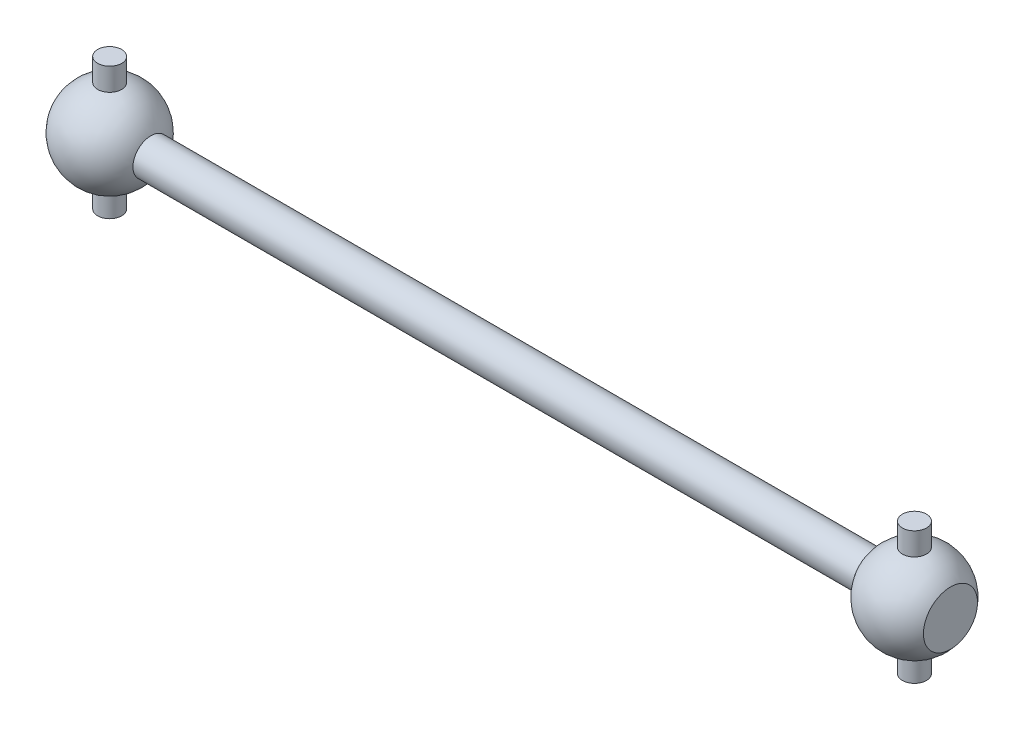
ISO-10303-21;
HEADER;
FILE_DESCRIPTION(('STEP AP214'),'2;1');
FILE_NAME('part.step','',(''),(''),'','','');
FILE_SCHEMA(('AUTOMOTIVE_DESIGN { 1 0 10303 214 1 1 1 1 }'));
ENDSEC;
DATA;
#1=APPLICATION_CONTEXT('core data for automotive mechanical design processes');
#2=APPLICATION_PROTOCOL_DEFINITION('international standard','automotive_design',2000,#1);
#3=PRODUCT_CONTEXT('',#1,'mechanical');
#4=PRODUCT('Part','Part','',(#3));
#5=PRODUCT_RELATED_PRODUCT_CATEGORY('part','',(#4));
#6=PRODUCT_DEFINITION_FORMATION('','',#4);
#7=PRODUCT_DEFINITION_CONTEXT('part definition',#1,'design');
#8=PRODUCT_DEFINITION('design','',#6,#7);
#9=PRODUCT_DEFINITION_SHAPE('','',#8);
#10=(LENGTH_UNIT() NAMED_UNIT(*) SI_UNIT(.MILLI.,.METRE.));
#11=(NAMED_UNIT(*) PLANE_ANGLE_UNIT() SI_UNIT($,.RADIAN.));
#12=(NAMED_UNIT(*) SI_UNIT($,.STERADIAN.) SOLID_ANGLE_UNIT());
#13=UNCERTAINTY_MEASURE_WITH_UNIT(LENGTH_MEASURE(1.E-05),#10,'distance_accuracy_value','');
#14=(GEOMETRIC_REPRESENTATION_CONTEXT(3) GLOBAL_UNCERTAINTY_ASSIGNED_CONTEXT((#13)) GLOBAL_UNIT_ASSIGNED_CONTEXT((#10,
#11,#12)) REPRESENTATION_CONTEXT('',''));
#15=CARTESIAN_POINT('',(0.,0.,0.));
#16=DIRECTION('',(0.,0.,1.));
#17=DIRECTION('',(1.,0.,0.));
#18=AXIS2_PLACEMENT_3D('',#15,#16,#17);
#19=CARTESIAN_POINT('',(67.,0.,0.));
#20=DIRECTION('',(-1.,0.,0.));
#21=DIRECTION('',(0.,1.,0.));
#22=AXIS2_PLACEMENT_3D('',#19,#20,#21);
#23=SPHERICAL_SURFACE('',#22,7.5);
#24=CARTESIAN_POINT('',(60.1261364575663,0.,0.));
#25=DIRECTION('',(-1.,0.,0.));
#26=DIRECTION('',(0.,0.,1.));
#27=AXIS2_PLACEMENT_3D('',#24,#25,#26);
#28=CIRCLE('',#27,2.99999999999998);
#29=CARTESIAN_POINT('',(60.1261364575663,0.,2.99999999999998));
#30=VERTEX_POINT('',#29);
#31=EDGE_CURVE('E57',#30,#30,#28,.T.);
#32=ORIENTED_EDGE('',*,*,#31,.F.);
#33=EDGE_LOOP('',(#32));
#34=FACE_BOUND('',#33,.T.);
#35=CARTESIAN_POINT('',(73.,0.,0.));
#36=DIRECTION('',(-1.,0.,0.));
#37=DIRECTION('',(0.,0.,1.));
#38=AXIS2_PLACEMENT_3D('',#35,#36,#37);
#39=CIRCLE('',#38,4.5);
#40=CARTESIAN_POINT('',(73.,0.,4.5));
#41=VERTEX_POINT('',#40);
#42=EDGE_CURVE('E54',#41,#41,#39,.T.);
#43=ORIENTED_EDGE('',*,*,#42,.T.);
#44=EDGE_LOOP('',(#43));
#45=FACE_BOUND('',#44,.T.);
#46=CARTESIAN_POINT('',(67.,7.22841614740048,0.));
#47=DIRECTION('',(0.,-1.,0.));
#48=DIRECTION('',(0.,0.,-1.));
#49=AXIS2_PLACEMENT_3D('',#46,#47,#48);
#50=CIRCLE('',#49,2.);
#51=CARTESIAN_POINT('',(67.,7.22841614740048,-2.));
#52=VERTEX_POINT('',#51);
#53=EDGE_CURVE('E49',#52,#52,#50,.F.);
#54=ORIENTED_EDGE('',*,*,#53,.F.);
#55=EDGE_LOOP('',(#54));
#56=FACE_BOUND('',#55,.T.);
#57=CARTESIAN_POINT('',(67.,-7.22841614740048,0.));
#58=DIRECTION('',(0.,1.,0.));
#59=DIRECTION('',(0.,0.,1.));
#60=AXIS2_PLACEMENT_3D('',#57,#58,#59);
#61=CIRCLE('',#60,2.);
#62=CARTESIAN_POINT('',(67.,-7.22841614740048,2.));
#63=VERTEX_POINT('',#62);
#64=EDGE_CURVE('E45',#63,#63,#61,.F.);
#65=ORIENTED_EDGE('',*,*,#64,.F.);
#66=EDGE_LOOP('',(#65));
#67=FACE_BOUND('',#66,.T.);
#68=ADVANCED_FACE('F34',(#34,#45,#56,#67),#23,.T.);
#69=CARTESIAN_POINT('',(73.,-2.25128557771212E-13,0.));
#70=DIRECTION('',(-1.,0.,0.));
#71=DIRECTION('',(0.,0.,1.));
#72=AXIS2_PLACEMENT_3D('',#69,#70,#71);
#73=PLANE('',#72);
#74=ORIENTED_EDGE('',*,*,#42,.F.);
#75=EDGE_LOOP('',(#74));
#76=FACE_BOUND('',#75,.T.);
#77=ADVANCED_FACE('F36',(#76),#73,.F.);
#78=CARTESIAN_POINT('',(-104.662512521536,0.,0.));
#79=DIRECTION('',(-1.,0.,0.));
#80=DIRECTION('',(0.,0.,1.));
#81=AXIS2_PLACEMENT_3D('',#78,#79,#80);
#82=CYLINDRICAL_SURFACE('',#81,2.99999999999998);
#83=CARTESIAN_POINT('',(-60.1261364575662,0.,0.));
#84=DIRECTION('',(-1.,0.,0.));
#85=DIRECTION('',(0.,0.,1.));
#86=AXIS2_PLACEMENT_3D('',#83,#84,#85);
#87=CIRCLE('',#86,2.99999999999998);
#88=CARTESIAN_POINT('',(-60.1261364575662,0.,2.99999999999998));
#89=VERTEX_POINT('',#88);
#90=EDGE_CURVE('E60',#89,#89,#87,.T.);
#91=ORIENTED_EDGE('',*,*,#90,.F.);
#92=EDGE_LOOP('',(#91));
#93=FACE_BOUND('',#92,.T.);
#94=ORIENTED_EDGE('',*,*,#31,.T.);
#95=EDGE_LOOP('',(#94));
#96=FACE_BOUND('',#95,.T.);
#97=ADVANCED_FACE('F100',(#93,#96),#82,.T.);
#98=CARTESIAN_POINT('',(-67.,0.,0.));
#99=DIRECTION('',(-1.,0.,0.));
#100=DIRECTION('',(0.,1.,0.));
#101=AXIS2_PLACEMENT_3D('',#98,#99,#100);
#102=SPHERICAL_SURFACE('',#101,7.5);
#103=CARTESIAN_POINT('',(-67.,-7.22841614740048,0.));
#104=DIRECTION('',(0.,1.,0.));
#105=DIRECTION('',(0.,0.,1.));
#106=AXIS2_PLACEMENT_3D('',#103,#104,#105);
#107=CIRCLE('',#106,2.);
#108=CARTESIAN_POINT('',(-67.,-7.22841614740048,2.));
#109=VERTEX_POINT('',#108);
#110=EDGE_CURVE('E10',#109,#109,#107,.F.);
#111=ORIENTED_EDGE('',*,*,#110,.F.);
#112=EDGE_LOOP('',(#111));
#113=FACE_BOUND('',#112,.T.);
#114=CARTESIAN_POINT('',(-67.,7.22841614740048,0.));
#115=DIRECTION('',(0.,-1.,0.));
#116=DIRECTION('',(0.,0.,-1.));
#117=AXIS2_PLACEMENT_3D('',#114,#115,#116);
#118=CIRCLE('',#117,2.);
#119=CARTESIAN_POINT('',(-67.,7.22841614740048,-2.));
#120=VERTEX_POINT('',#119);
#121=EDGE_CURVE('E41',#120,#120,#118,.F.);
#122=ORIENTED_EDGE('',*,*,#121,.F.);
#123=EDGE_LOOP('',(#122));
#124=FACE_BOUND('',#123,.T.);
#125=ORIENTED_EDGE('',*,*,#90,.T.);
#126=EDGE_LOOP('',(#125));
#127=FACE_BOUND('',#126,.T.);
#128=CARTESIAN_POINT('',(-73.,0.,0.));
#129=DIRECTION('',(-1.,0.,0.));
#130=DIRECTION('',(0.,0.,1.));
#131=AXIS2_PLACEMENT_3D('',#128,#129,#130);
#132=CIRCLE('',#131,4.5);
#133=CARTESIAN_POINT('',(-73.,0.,4.5));
#134=VERTEX_POINT('',#133);
#135=EDGE_CURVE('E63',#134,#134,#132,.T.);
#136=ORIENTED_EDGE('',*,*,#135,.F.);
#137=EDGE_LOOP('',(#136));
#138=FACE_BOUND('',#137,.T.);
#139=ADVANCED_FACE('F107',(#113,#124,#127,#138),#102,.T.);
#140=CARTESIAN_POINT('',(-73.,-2.25128557771212E-13,0.));
#141=DIRECTION('',(-1.,0.,0.));
#142=DIRECTION('',(0.,0.,1.));
#143=AXIS2_PLACEMENT_3D('',#140,#141,#142);
#144=PLANE('',#143);
#145=ORIENTED_EDGE('',*,*,#135,.T.);
#146=EDGE_LOOP('',(#145));
#147=FACE_BOUND('',#146,.T.);
#148=ADVANCED_FACE('F111',(#147),#144,.T.);
#149=CARTESIAN_POINT('',(67.,11.,0.));
#150=DIRECTION('',(0.,1.,0.));
#151=DIRECTION('',(0.,0.,1.));
#152=AXIS2_PLACEMENT_3D('',#149,#150,#151);
#153=PLANE('',#152);
#154=CARTESIAN_POINT('',(67.,11.,0.));
#155=DIRECTION('',(0.,1.,0.));
#156=DIRECTION('',(0.,0.,1.));
#157=AXIS2_PLACEMENT_3D('',#154,#155,#156);
#158=CIRCLE('',#157,2.);
#159=CARTESIAN_POINT('',(67.,11.,2.));
#160=VERTEX_POINT('',#159);
#161=EDGE_CURVE('E66',#160,#160,#158,.T.);
#162=ORIENTED_EDGE('',*,*,#161,.T.);
#163=EDGE_LOOP('',(#162));
#164=FACE_BOUND('',#163,.T.);
#165=ADVANCED_FACE('F115',(#164),#153,.T.);
#166=CARTESIAN_POINT('',(67.,11.,0.));
#167=DIRECTION('',(0.,-1.,0.));
#168=DIRECTION('',(0.,0.,-1.));
#169=AXIS2_PLACEMENT_3D('',#166,#167,#168);
#170=CYLINDRICAL_SURFACE('',#169,2.);
#171=ORIENTED_EDGE('',*,*,#161,.F.);
#172=EDGE_LOOP('',(#171));
#173=FACE_BOUND('',#172,.T.);
#174=ORIENTED_EDGE('',*,*,#53,.T.);
#175=EDGE_LOOP('',(#174));
#176=FACE_BOUND('',#175,.T.);
#177=ADVANCED_FACE('F118',(#173,#176),#170,.T.);
#178=CARTESIAN_POINT('',(67.,-11.,0.));
#179=DIRECTION('',(0.,1.,0.));
#180=DIRECTION('',(0.,0.,1.));
#181=AXIS2_PLACEMENT_3D('',#178,#179,#180);
#182=CIRCLE('',#181,2.);
#183=CARTESIAN_POINT('',(67.,-11.,2.));
#184=VERTEX_POINT('',#183);
#185=EDGE_CURVE('E67',#184,#184,#182,.T.);
#186=ORIENTED_EDGE('',*,*,#185,.T.);
#187=EDGE_LOOP('',(#186));
#188=FACE_BOUND('',#187,.T.);
#189=ORIENTED_EDGE('',*,*,#64,.T.);
#190=EDGE_LOOP('',(#189));
#191=FACE_BOUND('',#190,.T.);
#192=ADVANCED_FACE('F91',(#188,#191),#170,.T.);
#193=CARTESIAN_POINT('',(67.,-11.,0.));
#194=DIRECTION('',(0.,1.,0.));
#195=DIRECTION('',(0.,0.,1.));
#196=AXIS2_PLACEMENT_3D('',#193,#194,#195);
#197=PLANE('',#196);
#198=ORIENTED_EDGE('',*,*,#185,.F.);
#199=EDGE_LOOP('',(#198));
#200=FACE_BOUND('',#199,.T.);
#201=ADVANCED_FACE('F83',(#200),#197,.F.);
#202=CARTESIAN_POINT('',(-67.,11.,0.));
#203=DIRECTION('',(0.,1.,0.));
#204=DIRECTION('',(0.,0.,1.));
#205=AXIS2_PLACEMENT_3D('',#202,#203,#204);
#206=PLANE('',#205);
#207=CARTESIAN_POINT('',(-67.,11.,0.));
#208=DIRECTION('',(0.,-1.,0.));
#209=DIRECTION('',(0.,0.,1.));
#210=AXIS2_PLACEMENT_3D('',#207,#208,#209);
#211=CIRCLE('',#210,2.);
#212=CARTESIAN_POINT('',(-67.,11.,2.));
#213=VERTEX_POINT('',#212);
#214=EDGE_CURVE('E70',#213,#213,#211,.T.);
#215=ORIENTED_EDGE('',*,*,#214,.F.);
#216=EDGE_LOOP('',(#215));
#217=FACE_BOUND('',#216,.T.);
#218=ADVANCED_FACE('F81',(#217),#206,.T.);
#219=CARTESIAN_POINT('',(-67.,11.,0.));
#220=DIRECTION('',(0.,-1.,0.));
#221=DIRECTION('',(0.,0.,-1.));
#222=AXIS2_PLACEMENT_3D('',#219,#220,#221);
#223=CYLINDRICAL_SURFACE('',#222,2.);
#224=ORIENTED_EDGE('',*,*,#121,.T.);
#225=EDGE_LOOP('',(#224));
#226=FACE_BOUND('',#225,.T.);
#227=ORIENTED_EDGE('',*,*,#214,.T.);
#228=EDGE_LOOP('',(#227));
#229=FACE_BOUND('',#228,.T.);
#230=ADVANCED_FACE('F79',(#226,#229),#223,.T.);
#231=ORIENTED_EDGE('',*,*,#110,.T.);
#232=EDGE_LOOP('',(#231));
#233=FACE_BOUND('',#232,.T.);
#234=CARTESIAN_POINT('',(-67.,-11.,0.));
#235=DIRECTION('',(0.,-1.,0.));
#236=DIRECTION('',(0.,0.,1.));
#237=AXIS2_PLACEMENT_3D('',#234,#235,#236);
#238=CIRCLE('',#237,2.);
#239=CARTESIAN_POINT('',(-67.,-11.,2.));
#240=VERTEX_POINT('',#239);
#241=EDGE_CURVE('E73',#240,#240,#238,.T.);
#242=ORIENTED_EDGE('',*,*,#241,.F.);
#243=EDGE_LOOP('',(#242));
#244=FACE_BOUND('',#243,.T.);
#245=ADVANCED_FACE('F89',(#233,#244),#223,.T.);
#246=CARTESIAN_POINT('',(-67.,-11.,0.));
#247=DIRECTION('',(0.,1.,0.));
#248=DIRECTION('',(0.,0.,1.));
#249=AXIS2_PLACEMENT_3D('',#246,#247,#248);
#250=PLANE('',#249);
#251=ORIENTED_EDGE('',*,*,#241,.T.);
#252=EDGE_LOOP('',(#251));
#253=FACE_BOUND('',#252,.T.);
#254=ADVANCED_FACE('F123',(#253),#250,.F.);
#255=CLOSED_SHELL('',(#68,#77,#97,#139,#148,#165,#177,#192,#201,#218,#230,#245,#254));
#256=MANIFOLD_SOLID_BREP('B2',#255);
#257=ADVANCED_BREP_SHAPE_REPRESENTATION('',(#18,#256),#14);
#258=SHAPE_DEFINITION_REPRESENTATION(#9,#257);
ENDSEC;
END-ISO-10303-21;
